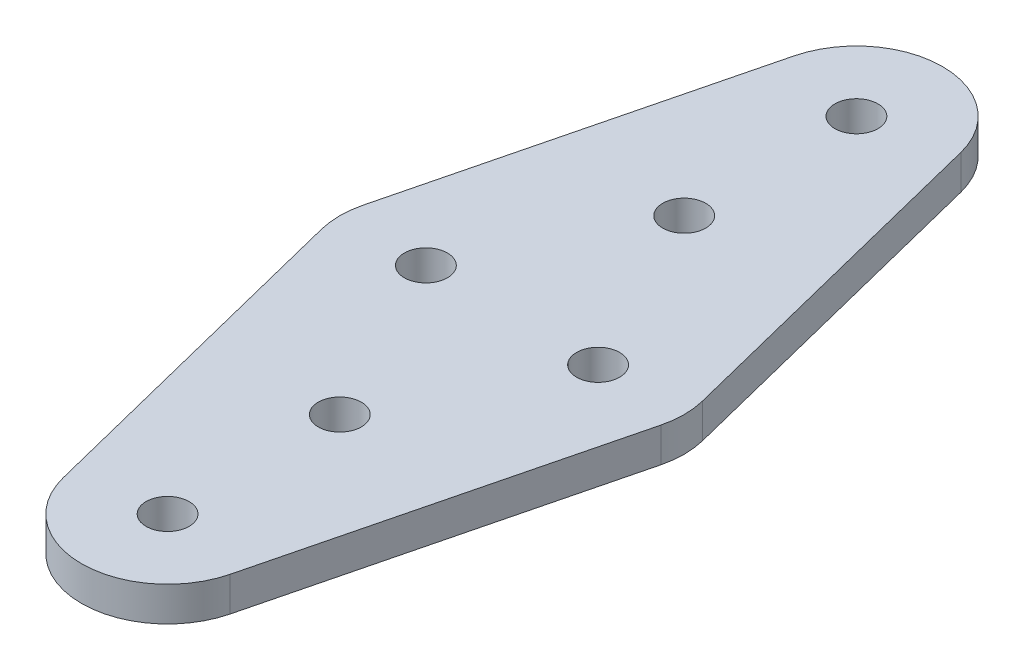
ISO-10303-21;
HEADER;
FILE_DESCRIPTION(('STEP AP214'),'2;1');
FILE_NAME('part.step','',(''),(''),'','','');
FILE_SCHEMA(('AUTOMOTIVE_DESIGN { 1 0 10303 214 1 1 1 1 }'));
ENDSEC;
DATA;
#1=APPLICATION_CONTEXT('core data for automotive mechanical design processes');
#2=APPLICATION_PROTOCOL_DEFINITION('international standard','automotive_design',2000,#1);
#3=PRODUCT_CONTEXT('',#1,'mechanical');
#4=PRODUCT('Part','Part','',(#3));
#5=PRODUCT_RELATED_PRODUCT_CATEGORY('part','',(#4));
#6=PRODUCT_DEFINITION_FORMATION('','',#4);
#7=PRODUCT_DEFINITION_CONTEXT('part definition',#1,'design');
#8=PRODUCT_DEFINITION('design','',#6,#7);
#9=PRODUCT_DEFINITION_SHAPE('','',#8);
#10=(LENGTH_UNIT() NAMED_UNIT(*) SI_UNIT(.MILLI.,.METRE.));
#11=(NAMED_UNIT(*) PLANE_ANGLE_UNIT() SI_UNIT($,.RADIAN.));
#12=(NAMED_UNIT(*) SI_UNIT($,.STERADIAN.) SOLID_ANGLE_UNIT());
#13=UNCERTAINTY_MEASURE_WITH_UNIT(LENGTH_MEASURE(1.E-05),#10,'distance_accuracy_value','');
#14=(GEOMETRIC_REPRESENTATION_CONTEXT(3) GLOBAL_UNCERTAINTY_ASSIGNED_CONTEXT((#13)) GLOBAL_UNIT_ASSIGNED_CONTEXT((#10,
#11,#12)) REPRESENTATION_CONTEXT('',''));
#15=CARTESIAN_POINT('',(0.,0.,0.));
#16=DIRECTION('',(0.,0.,1.));
#17=DIRECTION('',(1.,0.,0.));
#18=AXIS2_PLACEMENT_3D('',#15,#16,#17);
#19=CARTESIAN_POINT('',(-9.99999999999999,4.,0.));
#20=DIRECTION('',(0.,1.,0.));
#21=DIRECTION('',(0.,0.,1.));
#22=AXIS2_PLACEMENT_3D('',#19,#20,#21);
#23=PLANE('',#22);
#24=CARTESIAN_POINT('',(0.,4.,20.));
#25=DIRECTION('',(0.,1.,0.));
#26=DIRECTION('',(0.,0.,-1.));
#27=AXIS2_PLACEMENT_3D('',#24,#25,#26);
#28=CIRCLE('',#27,2.5);
#29=CARTESIAN_POINT('',(0.,4.,17.5));
#30=VERTEX_POINT('',#29);
#31=EDGE_CURVE('E199',#30,#30,#28,.T.);
#32=ORIENTED_EDGE('',*,*,#31,.F.);
#33=EDGE_LOOP('',(#32));
#34=FACE_BOUND('',#33,.T.);
#35=CARTESIAN_POINT('',(0.,4.,-20.));
#36=DIRECTION('',(0.,1.,0.));
#37=DIRECTION('',(0.,0.,1.));
#38=AXIS2_PLACEMENT_3D('',#35,#36,#37);
#39=CIRCLE('',#38,2.5);
#40=CARTESIAN_POINT('',(0.,4.,-17.5));
#41=VERTEX_POINT('',#40);
#42=EDGE_CURVE('E187',#41,#41,#39,.T.);
#43=ORIENTED_EDGE('',*,*,#42,.F.);
#44=EDGE_LOOP('',(#43));
#45=FACE_BOUND('',#44,.T.);
#46=CARTESIAN_POINT('',(10.,4.,0.));
#47=DIRECTION('',(0.,1.,0.));
#48=DIRECTION('',(0.,0.,1.));
#49=AXIS2_PLACEMENT_3D('',#46,#47,#48);
#50=CIRCLE('',#49,2.5);
#51=CARTESIAN_POINT('',(10.,4.,2.5));
#52=VERTEX_POINT('',#51);
#53=EDGE_CURVE('E133',#52,#52,#50,.T.);
#54=ORIENTED_EDGE('',*,*,#53,.F.);
#55=EDGE_LOOP('',(#54));
#56=FACE_BOUND('',#55,.T.);
#57=CARTESIAN_POINT('',(-9.99999999999999,4.,0.));
#58=DIRECTION('',(0.,1.,0.));
#59=DIRECTION('',(0.,0.,1.));
#60=AXIS2_PLACEMENT_3D('',#57,#58,#59);
#61=CIRCLE('',#60,10.);
#62=CARTESIAN_POINT('',(-19.7014250014533,4.,-2.42535625036333));
#63=VERTEX_POINT('',#62);
#64=CARTESIAN_POINT('',(-19.7014250014533,4.,2.42535625036333));
#65=VERTEX_POINT('',#64);
#66=EDGE_CURVE('E144',#63,#65,#61,.T.);
#67=ORIENTED_EDGE('',*,*,#66,.T.);
#68=DIRECTION('',(0.242535625036333,0.,0.970142500145332));
#69=VECTOR('',#68,1.);
#70=CARTESIAN_POINT('',(-9.70142500145332,4.,42.4253562503633));
#71=LINE('',#70,#69);
#72=CARTESIAN_POINT('',(-9.70142500145332,4.,42.4253562503633));
#73=VERTEX_POINT('',#72);
#74=EDGE_CURVE('E92',#65,#73,#71,.T.);
#75=ORIENTED_EDGE('',*,*,#74,.T.);
#76=CARTESIAN_POINT('',(0.,4.,40.));
#77=DIRECTION('',(0.,1.,0.));
#78=DIRECTION('',(0.,0.,-1.));
#79=AXIS2_PLACEMENT_3D('',#76,#77,#78);
#80=CIRCLE('',#79,10.);
#81=CARTESIAN_POINT('',(9.70142500145332,4.,42.4253562503633));
#82=VERTEX_POINT('',#81);
#83=EDGE_CURVE('E159',#73,#82,#80,.T.);
#84=ORIENTED_EDGE('',*,*,#83,.T.);
#85=DIRECTION('',(0.242535625036333,0.,-0.970142500145332));
#86=VECTOR('',#85,1.);
#87=CARTESIAN_POINT('',(9.70142500145332,4.,42.4253562503633));
#88=LINE('',#87,#86);
#89=CARTESIAN_POINT('',(19.7014250014533,4.,2.42535625036333));
#90=VERTEX_POINT('',#89);
#91=EDGE_CURVE('E172',#82,#90,#88,.T.);
#92=ORIENTED_EDGE('',*,*,#91,.T.);
#93=CARTESIAN_POINT('',(10.,4.,0.));
#94=DIRECTION('',(0.,1.,0.));
#95=DIRECTION('',(0.,0.,1.));
#96=AXIS2_PLACEMENT_3D('',#93,#94,#95);
#97=CIRCLE('',#96,10.);
#98=CARTESIAN_POINT('',(19.7014250014533,4.,-2.42535625036333));
#99=VERTEX_POINT('',#98);
#100=EDGE_CURVE('E111',#90,#99,#97,.T.);
#101=ORIENTED_EDGE('',*,*,#100,.T.);
#102=DIRECTION('',(-0.242535625036333,0.,-0.970142500145332));
#103=VECTOR('',#102,1.);
#104=CARTESIAN_POINT('',(9.70142500145332,4.,-42.4253562503633));
#105=LINE('',#104,#103);
#106=CARTESIAN_POINT('',(9.70142500145332,4.,-42.4253562503633));
#107=VERTEX_POINT('',#106);
#108=EDGE_CURVE('E105',#99,#107,#105,.T.);
#109=ORIENTED_EDGE('',*,*,#108,.T.);
#110=CARTESIAN_POINT('',(0.,4.,-40.));
#111=DIRECTION('',(0.,1.,0.));
#112=DIRECTION('',(0.,0.,1.));
#113=AXIS2_PLACEMENT_3D('',#110,#111,#112);
#114=CIRCLE('',#113,10.);
#115=CARTESIAN_POINT('',(-9.70142500145332,4.,-42.4253562503633));
#116=VERTEX_POINT('',#115);
#117=EDGE_CURVE('E109',#107,#116,#114,.T.);
#118=ORIENTED_EDGE('',*,*,#117,.T.);
#119=DIRECTION('',(-0.242535625036333,0.,0.970142500145332));
#120=VECTOR('',#119,1.);
#121=CARTESIAN_POINT('',(-9.70142500145332,4.,-42.4253562503633));
#122=LINE('',#121,#120);
#123=EDGE_CURVE('E49',#116,#63,#122,.T.);
#124=ORIENTED_EDGE('',*,*,#123,.T.);
#125=EDGE_LOOP('',(#67,#75,#84,#92,#101,#109,#118,#124));
#126=FACE_BOUND('',#125,.T.);
#127=CARTESIAN_POINT('',(-9.99999999999999,4.,0.));
#128=DIRECTION('',(0.,1.,0.));
#129=DIRECTION('',(0.,0.,-1.));
#130=AXIS2_PLACEMENT_3D('',#127,#128,#129);
#131=CIRCLE('',#130,2.5);
#132=CARTESIAN_POINT('',(-9.99999999999999,4.,-2.5));
#133=VERTEX_POINT('',#132);
#134=EDGE_CURVE('E181',#133,#133,#131,.T.);
#135=ORIENTED_EDGE('',*,*,#134,.F.);
#136=EDGE_LOOP('',(#135));
#137=FACE_BOUND('',#136,.T.);
#138=CARTESIAN_POINT('',(0.,4.,-40.));
#139=DIRECTION('',(0.,1.,0.));
#140=DIRECTION('',(0.,0.,1.));
#141=AXIS2_PLACEMENT_3D('',#138,#139,#140);
#142=CIRCLE('',#141,2.5);
#143=CARTESIAN_POINT('',(0.,4.,-37.5));
#144=VERTEX_POINT('',#143);
#145=EDGE_CURVE('E193',#144,#144,#142,.T.);
#146=ORIENTED_EDGE('',*,*,#145,.F.);
#147=EDGE_LOOP('',(#146));
#148=FACE_BOUND('',#147,.T.);
#149=CARTESIAN_POINT('',(0.,4.,40.));
#150=DIRECTION('',(0.,1.,0.));
#151=DIRECTION('',(0.,0.,-1.));
#152=AXIS2_PLACEMENT_3D('',#149,#150,#151);
#153=CIRCLE('',#152,2.5);
#154=CARTESIAN_POINT('',(0.,4.,37.5));
#155=VERTEX_POINT('',#154);
#156=EDGE_CURVE('E205',#155,#155,#153,.T.);
#157=ORIENTED_EDGE('',*,*,#156,.F.);
#158=EDGE_LOOP('',(#157));
#159=FACE_BOUND('',#158,.T.);
#160=ADVANCED_FACE('F32',(#34,#45,#56,#126,#137,#148,#159),#23,.T.);
#161=CARTESIAN_POINT('',(-9.99999999999999,0.,0.));
#162=DIRECTION('',(0.,1.,0.));
#163=DIRECTION('',(0.,0.,1.));
#164=AXIS2_PLACEMENT_3D('',#161,#162,#163);
#165=PLANE('',#164);
#166=CARTESIAN_POINT('',(-9.99999999999999,0.,0.));
#167=DIRECTION('',(0.,1.,0.));
#168=DIRECTION('',(0.,0.,1.));
#169=AXIS2_PLACEMENT_3D('',#166,#167,#168);
#170=CIRCLE('',#169,10.);
#171=CARTESIAN_POINT('',(-19.7014250014533,0.,-2.42535625036333));
#172=VERTEX_POINT('',#171);
#173=CARTESIAN_POINT('',(-19.7014250014533,0.,2.42535625036333));
#174=VERTEX_POINT('',#173);
#175=EDGE_CURVE('E129',#172,#174,#170,.T.);
#176=ORIENTED_EDGE('',*,*,#175,.F.);
#177=DIRECTION('',(-0.242535625036333,0.,0.970142500145332));
#178=VECTOR('',#177,1.);
#179=CARTESIAN_POINT('',(-9.70142500145332,0.,-42.4253562503633));
#180=LINE('',#179,#178);
#181=CARTESIAN_POINT('',(-9.70142500145332,0.,-42.4253562503633));
#182=VERTEX_POINT('',#181);
#183=EDGE_CURVE('E84',#182,#172,#180,.T.);
#184=ORIENTED_EDGE('',*,*,#183,.F.);
#185=CARTESIAN_POINT('',(0.,0.,-40.));
#186=DIRECTION('',(0.,1.,0.));
#187=DIRECTION('',(0.,0.,1.));
#188=AXIS2_PLACEMENT_3D('',#185,#186,#187);
#189=CIRCLE('',#188,10.);
#190=CARTESIAN_POINT('',(9.70142500145332,0.,-42.4253562503633));
#191=VERTEX_POINT('',#190);
#192=EDGE_CURVE('E78',#191,#182,#189,.T.);
#193=ORIENTED_EDGE('',*,*,#192,.F.);
#194=DIRECTION('',(-0.242535625036333,0.,-0.970142500145332));
#195=VECTOR('',#194,1.);
#196=CARTESIAN_POINT('',(9.70142500145332,0.,-42.4253562503633));
#197=LINE('',#196,#195);
#198=CARTESIAN_POINT('',(19.7014250014533,0.,-2.42535625036333));
#199=VERTEX_POINT('',#198);
#200=EDGE_CURVE('E119',#199,#191,#197,.T.);
#201=ORIENTED_EDGE('',*,*,#200,.F.);
#202=CARTESIAN_POINT('',(10.,0.,0.));
#203=DIRECTION('',(0.,1.,0.));
#204=DIRECTION('',(0.,0.,1.));
#205=AXIS2_PLACEMENT_3D('',#202,#203,#204);
#206=CIRCLE('',#205,10.);
#207=CARTESIAN_POINT('',(19.7014250014533,0.,2.42535625036333));
#208=VERTEX_POINT('',#207);
#209=EDGE_CURVE('E139',#208,#199,#206,.T.);
#210=ORIENTED_EDGE('',*,*,#209,.F.);
#211=DIRECTION('',(0.242535625036333,0.,-0.970142500145332));
#212=VECTOR('',#211,1.);
#213=CARTESIAN_POINT('',(9.70142500145332,0.,42.4253562503633));
#214=LINE('',#213,#212);
#215=CARTESIAN_POINT('',(9.70142500145332,0.,42.4253562503633));
#216=VERTEX_POINT('',#215);
#217=EDGE_CURVE('E137',#216,#208,#214,.T.);
#218=ORIENTED_EDGE('',*,*,#217,.F.);
#219=CARTESIAN_POINT('',(0.,0.,40.));
#220=DIRECTION('',(0.,1.,0.));
#221=DIRECTION('',(0.,0.,-1.));
#222=AXIS2_PLACEMENT_3D('',#219,#220,#221);
#223=CIRCLE('',#222,10.);
#224=CARTESIAN_POINT('',(-9.70142500145332,0.,42.4253562503633));
#225=VERTEX_POINT('',#224);
#226=EDGE_CURVE('E135',#225,#216,#223,.T.);
#227=ORIENTED_EDGE('',*,*,#226,.F.);
#228=DIRECTION('',(0.242535625036333,0.,0.970142500145332));
#229=VECTOR('',#228,1.);
#230=CARTESIAN_POINT('',(-9.70142500145332,0.,42.4253562503633));
#231=LINE('',#230,#229);
#232=EDGE_CURVE('E132',#174,#225,#231,.T.);
#233=ORIENTED_EDGE('',*,*,#232,.F.);
#234=EDGE_LOOP('',(#176,#184,#193,#201,#210,#218,#227,#233));
#235=FACE_BOUND('',#234,.T.);
#236=CARTESIAN_POINT('',(10.,0.,0.));
#237=DIRECTION('',(0.,1.,0.));
#238=DIRECTION('',(0.,0.,1.));
#239=AXIS2_PLACEMENT_3D('',#236,#237,#238);
#240=CIRCLE('',#239,2.5);
#241=CARTESIAN_POINT('',(10.,0.,2.5));
#242=VERTEX_POINT('',#241);
#243=EDGE_CURVE('E178',#242,#242,#240,.T.);
#244=ORIENTED_EDGE('',*,*,#243,.T.);
#245=EDGE_LOOP('',(#244));
#246=FACE_BOUND('',#245,.T.);
#247=CARTESIAN_POINT('',(-9.99999999999999,0.,0.));
#248=DIRECTION('',(0.,1.,0.));
#249=DIRECTION('',(0.,0.,-1.));
#250=AXIS2_PLACEMENT_3D('',#247,#248,#249);
#251=CIRCLE('',#250,2.5);
#252=CARTESIAN_POINT('',(-9.99999999999999,0.,-2.5));
#253=VERTEX_POINT('',#252);
#254=EDGE_CURVE('E184',#253,#253,#251,.T.);
#255=ORIENTED_EDGE('',*,*,#254,.T.);
#256=EDGE_LOOP('',(#255));
#257=FACE_BOUND('',#256,.T.);
#258=CARTESIAN_POINT('',(0.,0.,-20.));
#259=DIRECTION('',(0.,1.,0.));
#260=DIRECTION('',(0.,0.,1.));
#261=AXIS2_PLACEMENT_3D('',#258,#259,#260);
#262=CIRCLE('',#261,2.5);
#263=CARTESIAN_POINT('',(0.,0.,-17.5));
#264=VERTEX_POINT('',#263);
#265=EDGE_CURVE('E190',#264,#264,#262,.T.);
#266=ORIENTED_EDGE('',*,*,#265,.T.);
#267=EDGE_LOOP('',(#266));
#268=FACE_BOUND('',#267,.T.);
#269=CARTESIAN_POINT('',(0.,0.,-40.));
#270=DIRECTION('',(0.,1.,0.));
#271=DIRECTION('',(0.,0.,1.));
#272=AXIS2_PLACEMENT_3D('',#269,#270,#271);
#273=CIRCLE('',#272,2.5);
#274=CARTESIAN_POINT('',(0.,0.,-37.5));
#275=VERTEX_POINT('',#274);
#276=EDGE_CURVE('E196',#275,#275,#273,.T.);
#277=ORIENTED_EDGE('',*,*,#276,.T.);
#278=EDGE_LOOP('',(#277));
#279=FACE_BOUND('',#278,.T.);
#280=CARTESIAN_POINT('',(0.,0.,20.));
#281=DIRECTION('',(0.,1.,0.));
#282=DIRECTION('',(0.,0.,-1.));
#283=AXIS2_PLACEMENT_3D('',#280,#281,#282);
#284=CIRCLE('',#283,2.5);
#285=CARTESIAN_POINT('',(0.,0.,17.5));
#286=VERTEX_POINT('',#285);
#287=EDGE_CURVE('E202',#286,#286,#284,.T.);
#288=ORIENTED_EDGE('',*,*,#287,.T.);
#289=EDGE_LOOP('',(#288));
#290=FACE_BOUND('',#289,.T.);
#291=CARTESIAN_POINT('',(0.,0.,40.));
#292=DIRECTION('',(0.,1.,0.));
#293=DIRECTION('',(0.,0.,-1.));
#294=AXIS2_PLACEMENT_3D('',#291,#292,#293);
#295=CIRCLE('',#294,2.5);
#296=CARTESIAN_POINT('',(0.,0.,37.5));
#297=VERTEX_POINT('',#296);
#298=EDGE_CURVE('E208',#297,#297,#295,.T.);
#299=ORIENTED_EDGE('',*,*,#298,.T.);
#300=EDGE_LOOP('',(#299));
#301=FACE_BOUND('',#300,.T.);
#302=ADVANCED_FACE('F163',(#235,#246,#257,#268,#279,#290,#301),#165,.F.);
#303=CARTESIAN_POINT('',(-9.99999999999999,4.,0.));
#304=DIRECTION('',(0.,-1.,0.));
#305=DIRECTION('',(0.,0.,-1.));
#306=AXIS2_PLACEMENT_3D('',#303,#304,#305);
#307=CYLINDRICAL_SURFACE('',#306,10.);
#308=ORIENTED_EDGE('',*,*,#175,.T.);
#309=DIRECTION('',(0.,-1.,0.));
#310=VECTOR('',#309,1.);
#311=CARTESIAN_POINT('',(-19.7014250014533,4.,2.42535625036333));
#312=LINE('',#311,#310);
#313=EDGE_CURVE('E11',#65,#174,#312,.T.);
#314=ORIENTED_EDGE('',*,*,#313,.F.);
#315=ORIENTED_EDGE('',*,*,#66,.F.);
#316=DIRECTION('',(0.,-1.,0.));
#317=VECTOR('',#316,1.);
#318=CARTESIAN_POINT('',(-19.7014250014533,4.,-2.42535625036333));
#319=LINE('',#318,#317);
#320=EDGE_CURVE('E125',#63,#172,#319,.T.);
#321=ORIENTED_EDGE('',*,*,#320,.T.);
#322=EDGE_LOOP('',(#308,#314,#315,#321));
#323=FACE_BOUND('',#322,.T.);
#324=ADVANCED_FACE('F34',(#323),#307,.T.);
#325=CARTESIAN_POINT('',(-9.70142500145332,4.,42.4253562503633));
#326=DIRECTION('',(0.970142500145332,0.,-0.242535625036333));
#327=DIRECTION('',(-0.242535625036333,0.,-0.970142500145332));
#328=AXIS2_PLACEMENT_3D('',#325,#326,#327);
#329=PLANE('',#328);
#330=ORIENTED_EDGE('',*,*,#232,.T.);
#331=DIRECTION('',(0.,-1.,0.));
#332=VECTOR('',#331,1.);
#333=CARTESIAN_POINT('',(-9.70142500145332,4.,42.4253562503633));
#334=LINE('',#333,#332);
#335=EDGE_CURVE('E41',#73,#225,#334,.T.);
#336=ORIENTED_EDGE('',*,*,#335,.F.);
#337=ORIENTED_EDGE('',*,*,#74,.F.);
#338=ORIENTED_EDGE('',*,*,#313,.T.);
#339=EDGE_LOOP('',(#330,#336,#337,#338));
#340=FACE_BOUND('',#339,.T.);
#341=ADVANCED_FACE('F242',(#340),#329,.F.);
#342=CARTESIAN_POINT('',(0.,4.,40.));
#343=DIRECTION('',(0.,-1.,0.));
#344=DIRECTION('',(0.,0.,-1.));
#345=AXIS2_PLACEMENT_3D('',#342,#343,#344);
#346=CYLINDRICAL_SURFACE('',#345,10.);
#347=ORIENTED_EDGE('',*,*,#226,.T.);
#348=DIRECTION('',(0.,-1.,0.));
#349=VECTOR('',#348,1.);
#350=CARTESIAN_POINT('',(9.70142500145332,4.,42.4253562503633));
#351=LINE('',#350,#349);
#352=EDGE_CURVE('E151',#82,#216,#351,.T.);
#353=ORIENTED_EDGE('',*,*,#352,.F.);
#354=ORIENTED_EDGE('',*,*,#83,.F.);
#355=ORIENTED_EDGE('',*,*,#335,.T.);
#356=EDGE_LOOP('',(#347,#353,#354,#355));
#357=FACE_BOUND('',#356,.T.);
#358=ADVANCED_FACE('F157',(#357),#346,.T.);
#359=CARTESIAN_POINT('',(9.70142500145332,4.,42.4253562503633));
#360=DIRECTION('',(-0.970142500145332,0.,-0.242535625036333));
#361=DIRECTION('',(-0.242535625036333,0.,0.970142500145332));
#362=AXIS2_PLACEMENT_3D('',#359,#360,#361);
#363=PLANE('',#362);
#364=ORIENTED_EDGE('',*,*,#217,.T.);
#365=DIRECTION('',(0.,-1.,0.));
#366=VECTOR('',#365,1.);
#367=CARTESIAN_POINT('',(19.7014250014533,4.,2.42535625036333));
#368=LINE('',#367,#366);
#369=EDGE_CURVE('E148',#90,#208,#368,.T.);
#370=ORIENTED_EDGE('',*,*,#369,.F.);
#371=ORIENTED_EDGE('',*,*,#91,.F.);
#372=ORIENTED_EDGE('',*,*,#352,.T.);
#373=EDGE_LOOP('',(#364,#370,#371,#372));
#374=FACE_BOUND('',#373,.T.);
#375=ADVANCED_FACE('F168',(#374),#363,.F.);
#376=CARTESIAN_POINT('',(10.,4.,0.));
#377=DIRECTION('',(0.,-1.,0.));
#378=DIRECTION('',(0.,0.,-1.));
#379=AXIS2_PLACEMENT_3D('',#376,#377,#378);
#380=CYLINDRICAL_SURFACE('',#379,10.);
#381=ORIENTED_EDGE('',*,*,#209,.T.);
#382=DIRECTION('',(0.,-1.,0.));
#383=VECTOR('',#382,1.);
#384=CARTESIAN_POINT('',(19.7014250014533,4.,-2.42535625036333));
#385=LINE('',#384,#383);
#386=EDGE_CURVE('E120',#99,#199,#385,.T.);
#387=ORIENTED_EDGE('',*,*,#386,.F.);
#388=ORIENTED_EDGE('',*,*,#100,.F.);
#389=ORIENTED_EDGE('',*,*,#369,.T.);
#390=EDGE_LOOP('',(#381,#387,#388,#389));
#391=FACE_BOUND('',#390,.T.);
#392=ADVANCED_FACE('F171',(#391),#380,.T.);
#393=CARTESIAN_POINT('',(9.70142500145332,4.,-42.4253562503633));
#394=DIRECTION('',(-0.970142500145332,0.,0.242535625036333));
#395=DIRECTION('',(0.242535625036333,0.,0.970142500145332));
#396=AXIS2_PLACEMENT_3D('',#393,#394,#395);
#397=PLANE('',#396);
#398=ORIENTED_EDGE('',*,*,#200,.T.);
#399=DIRECTION('',(0.,-1.,0.));
#400=VECTOR('',#399,1.);
#401=CARTESIAN_POINT('',(9.70142500145332,4.,-42.4253562503633));
#402=LINE('',#401,#400);
#403=EDGE_CURVE('E116',#107,#191,#402,.T.);
#404=ORIENTED_EDGE('',*,*,#403,.F.);
#405=ORIENTED_EDGE('',*,*,#108,.F.);
#406=ORIENTED_EDGE('',*,*,#386,.T.);
#407=EDGE_LOOP('',(#398,#404,#405,#406));
#408=FACE_BOUND('',#407,.T.);
#409=ADVANCED_FACE('F117',(#408),#397,.F.);
#410=CARTESIAN_POINT('',(0.,4.,-40.));
#411=DIRECTION('',(0.,-1.,0.));
#412=DIRECTION('',(0.,0.,-1.));
#413=AXIS2_PLACEMENT_3D('',#410,#411,#412);
#414=CYLINDRICAL_SURFACE('',#413,10.);
#415=ORIENTED_EDGE('',*,*,#192,.T.);
#416=DIRECTION('',(0.,-1.,0.));
#417=VECTOR('',#416,1.);
#418=CARTESIAN_POINT('',(-9.70142500145332,4.,-42.4253562503633));
#419=LINE('',#418,#417);
#420=EDGE_CURVE('E121',#116,#182,#419,.T.);
#421=ORIENTED_EDGE('',*,*,#420,.F.);
#422=ORIENTED_EDGE('',*,*,#117,.F.);
#423=ORIENTED_EDGE('',*,*,#403,.T.);
#424=EDGE_LOOP('',(#415,#421,#422,#423));
#425=FACE_BOUND('',#424,.T.);
#426=ADVANCED_FACE('F123',(#425),#414,.T.);
#427=CARTESIAN_POINT('',(-9.70142500145332,4.,-42.4253562503633));
#428=DIRECTION('',(0.970142500145332,0.,0.242535625036333));
#429=DIRECTION('',(0.242535625036333,0.,-0.970142500145332));
#430=AXIS2_PLACEMENT_3D('',#427,#428,#429);
#431=PLANE('',#430);
#432=ORIENTED_EDGE('',*,*,#183,.T.);
#433=ORIENTED_EDGE('',*,*,#320,.F.);
#434=ORIENTED_EDGE('',*,*,#123,.F.);
#435=ORIENTED_EDGE('',*,*,#420,.T.);
#436=EDGE_LOOP('',(#432,#433,#434,#435));
#437=FACE_BOUND('',#436,.T.);
#438=ADVANCED_FACE('F230',(#437),#431,.F.);
#439=CARTESIAN_POINT('',(10.,4.,0.));
#440=DIRECTION('',(0.,-1.,0.));
#441=DIRECTION('',(0.,0.,-1.));
#442=AXIS2_PLACEMENT_3D('',#439,#440,#441);
#443=CYLINDRICAL_SURFACE('',#442,2.5);
#444=ORIENTED_EDGE('',*,*,#53,.T.);
#445=EDGE_LOOP('',(#444));
#446=FACE_BOUND('',#445,.T.);
#447=ORIENTED_EDGE('',*,*,#243,.F.);
#448=EDGE_LOOP('',(#447));
#449=FACE_BOUND('',#448,.T.);
#450=ADVANCED_FACE('F227',(#446,#449),#443,.F.);
#451=CARTESIAN_POINT('',(-9.99999999999999,4.,0.));
#452=DIRECTION('',(0.,-1.,0.));
#453=DIRECTION('',(0.,0.,-1.));
#454=AXIS2_PLACEMENT_3D('',#451,#452,#453);
#455=CYLINDRICAL_SURFACE('',#454,2.5);
#456=ORIENTED_EDGE('',*,*,#134,.T.);
#457=EDGE_LOOP('',(#456));
#458=FACE_BOUND('',#457,.T.);
#459=ORIENTED_EDGE('',*,*,#254,.F.);
#460=EDGE_LOOP('',(#459));
#461=FACE_BOUND('',#460,.T.);
#462=ADVANCED_FACE('F306',(#458,#461),#455,.F.);
#463=CARTESIAN_POINT('',(0.,4.,-20.));
#464=DIRECTION('',(0.,-1.,0.));
#465=DIRECTION('',(0.,0.,-1.));
#466=AXIS2_PLACEMENT_3D('',#463,#464,#465);
#467=CYLINDRICAL_SURFACE('',#466,2.5);
#468=ORIENTED_EDGE('',*,*,#42,.T.);
#469=EDGE_LOOP('',(#468));
#470=FACE_BOUND('',#469,.T.);
#471=ORIENTED_EDGE('',*,*,#265,.F.);
#472=EDGE_LOOP('',(#471));
#473=FACE_BOUND('',#472,.T.);
#474=ADVANCED_FACE('F314',(#470,#473),#467,.F.);
#475=CARTESIAN_POINT('',(0.,4.,-40.));
#476=DIRECTION('',(0.,-1.,0.));
#477=DIRECTION('',(0.,0.,-1.));
#478=AXIS2_PLACEMENT_3D('',#475,#476,#477);
#479=CYLINDRICAL_SURFACE('',#478,2.5);
#480=ORIENTED_EDGE('',*,*,#145,.T.);
#481=EDGE_LOOP('',(#480));
#482=FACE_BOUND('',#481,.T.);
#483=ORIENTED_EDGE('',*,*,#276,.F.);
#484=EDGE_LOOP('',(#483));
#485=FACE_BOUND('',#484,.T.);
#486=ADVANCED_FACE('F322',(#482,#485),#479,.F.);
#487=CARTESIAN_POINT('',(0.,4.,20.));
#488=DIRECTION('',(0.,-1.,0.));
#489=DIRECTION('',(0.,0.,-1.));
#490=AXIS2_PLACEMENT_3D('',#487,#488,#489);
#491=CYLINDRICAL_SURFACE('',#490,2.5);
#492=ORIENTED_EDGE('',*,*,#31,.T.);
#493=EDGE_LOOP('',(#492));
#494=FACE_BOUND('',#493,.T.);
#495=ORIENTED_EDGE('',*,*,#287,.F.);
#496=EDGE_LOOP('',(#495));
#497=FACE_BOUND('',#496,.T.);
#498=ADVANCED_FACE('F331',(#494,#497),#491,.F.);
#499=CARTESIAN_POINT('',(0.,4.,40.));
#500=DIRECTION('',(0.,-1.,0.));
#501=DIRECTION('',(0.,0.,-1.));
#502=AXIS2_PLACEMENT_3D('',#499,#500,#501);
#503=CYLINDRICAL_SURFACE('',#502,2.5);
#504=ORIENTED_EDGE('',*,*,#156,.T.);
#505=EDGE_LOOP('',(#504));
#506=FACE_BOUND('',#505,.T.);
#507=ORIENTED_EDGE('',*,*,#298,.F.);
#508=EDGE_LOOP('',(#507));
#509=FACE_BOUND('',#508,.T.);
#510=ADVANCED_FACE('F214',(#506,#509),#503,.F.);
#511=CLOSED_SHELL('',(#160,#302,#324,#341,#358,#375,#392,#409,#426,#438,#450,#462,#474,#486,
#498,#510));
#512=MANIFOLD_SOLID_BREP('B2',#511);
#513=ADVANCED_BREP_SHAPE_REPRESENTATION('',(#18,#512),#14);
#514=SHAPE_DEFINITION_REPRESENTATION(#9,#513);
ENDSEC;
END-ISO-10303-21;
